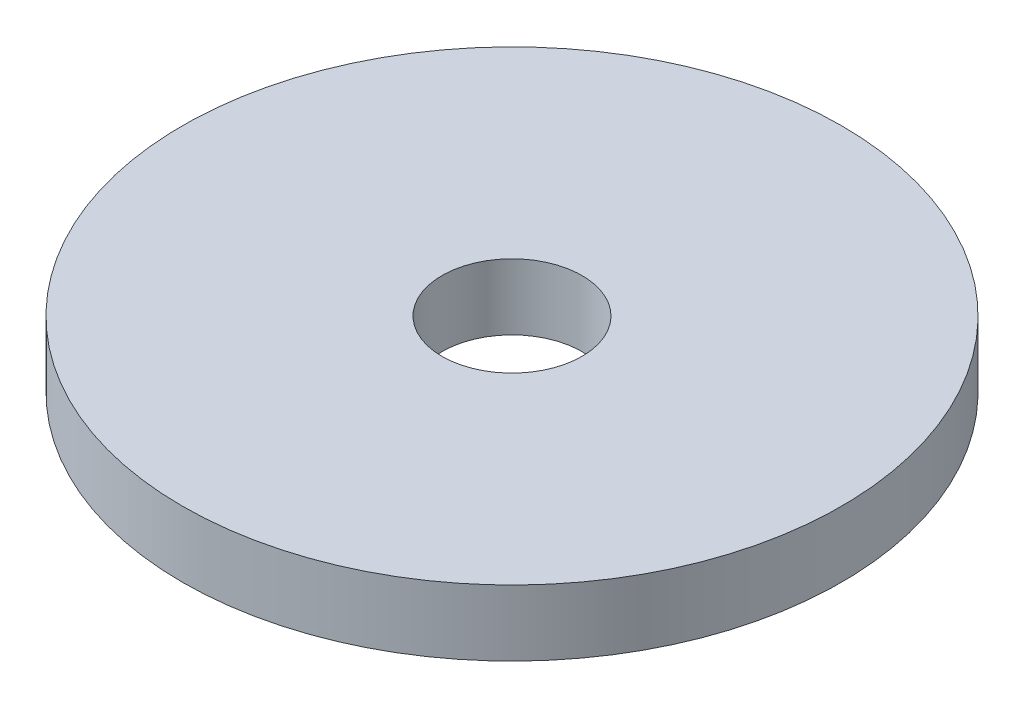
ISO-10303-21;
HEADER;
FILE_DESCRIPTION(('STEP AP214'),'2;1');
FILE_NAME('part.step','',(''),(''),'','','');
FILE_SCHEMA(('AUTOMOTIVE_DESIGN { 1 0 10303 214 1 1 1 1 }'));
ENDSEC;
DATA;
#1=APPLICATION_CONTEXT('core data for automotive mechanical design processes');
#2=APPLICATION_PROTOCOL_DEFINITION('international standard','automotive_design',2000,#1);
#3=PRODUCT_CONTEXT('',#1,'mechanical');
#4=PRODUCT('Part','Part','',(#3));
#5=PRODUCT_RELATED_PRODUCT_CATEGORY('part','',(#4));
#6=PRODUCT_DEFINITION_FORMATION('','',#4);
#7=PRODUCT_DEFINITION_CONTEXT('part definition',#1,'design');
#8=PRODUCT_DEFINITION('design','',#6,#7);
#9=PRODUCT_DEFINITION_SHAPE('','',#8);
#10=(LENGTH_UNIT() NAMED_UNIT(*) SI_UNIT(.MILLI.,.METRE.));
#11=(NAMED_UNIT(*) PLANE_ANGLE_UNIT() SI_UNIT($,.RADIAN.));
#12=(NAMED_UNIT(*) SI_UNIT($,.STERADIAN.) SOLID_ANGLE_UNIT());
#13=UNCERTAINTY_MEASURE_WITH_UNIT(LENGTH_MEASURE(1.E-05),#10,'distance_accuracy_value','');
#14=(GEOMETRIC_REPRESENTATION_CONTEXT(3) GLOBAL_UNCERTAINTY_ASSIGNED_CONTEXT((#13)) GLOBAL_UNIT_ASSIGNED_CONTEXT((#10,
#11,#12)) REPRESENTATION_CONTEXT('',''));
#15=CARTESIAN_POINT('',(0.,0.,0.));
#16=DIRECTION('',(0.,0.,1.));
#17=DIRECTION('',(1.,0.,0.));
#18=AXIS2_PLACEMENT_3D('',#15,#16,#17);
#19=CARTESIAN_POINT('',(0.,2.,0.));
#20=DIRECTION('',(0.,1.,0.));
#21=DIRECTION('',(0.,0.,1.));
#22=AXIS2_PLACEMENT_3D('',#19,#20,#21);
#23=PLANE('',#22);
#24=CARTESIAN_POINT('',(0.,2.,0.));
#25=DIRECTION('',(0.,1.,0.));
#26=DIRECTION('',(0.,0.,1.));
#27=AXIS2_PLACEMENT_3D('',#24,#25,#26);
#28=CIRCLE('',#27,10.);
#29=CARTESIAN_POINT('',(0.,2.,10.));
#30=VERTEX_POINT('',#29);
#31=EDGE_CURVE('E10',#30,#30,#28,.T.);
#32=ORIENTED_EDGE('',*,*,#31,.T.);
#33=EDGE_LOOP('',(#32));
#34=FACE_BOUND('',#33,.T.);
#35=CARTESIAN_POINT('',(0.,2.,0.));
#36=DIRECTION('',(0.,1.,0.));
#37=DIRECTION('',(0.,0.,1.));
#38=AXIS2_PLACEMENT_3D('',#35,#36,#37);
#39=CIRCLE('',#38,2.125);
#40=CARTESIAN_POINT('',(0.,2.,2.125));
#41=VERTEX_POINT('',#40);
#42=EDGE_CURVE('E50',#41,#41,#39,.T.);
#43=ORIENTED_EDGE('',*,*,#42,.F.);
#44=EDGE_LOOP('',(#43));
#45=FACE_BOUND('',#44,.T.);
#46=ADVANCED_FACE('F37',(#34,#45),#23,.T.);
#47=CARTESIAN_POINT('',(0.,0.,0.));
#48=DIRECTION('',(0.,1.,0.));
#49=DIRECTION('',(0.,0.,1.));
#50=AXIS2_PLACEMENT_3D('',#47,#48,#49);
#51=PLANE('',#50);
#52=CARTESIAN_POINT('',(0.,0.,0.));
#53=DIRECTION('',(0.,1.,0.));
#54=DIRECTION('',(0.,0.,1.));
#55=AXIS2_PLACEMENT_3D('',#52,#53,#54);
#56=CIRCLE('',#55,10.);
#57=CARTESIAN_POINT('',(0.,0.,10.));
#58=VERTEX_POINT('',#57);
#59=EDGE_CURVE('E41',#58,#58,#56,.T.);
#60=ORIENTED_EDGE('',*,*,#59,.F.);
#61=EDGE_LOOP('',(#60));
#62=FACE_BOUND('',#61,.T.);
#63=CARTESIAN_POINT('',(0.,0.,0.));
#64=DIRECTION('',(0.,1.,0.));
#65=DIRECTION('',(0.,0.,1.));
#66=AXIS2_PLACEMENT_3D('',#63,#64,#65);
#67=CIRCLE('',#66,2.125);
#68=CARTESIAN_POINT('',(0.,0.,2.125));
#69=VERTEX_POINT('',#68);
#70=EDGE_CURVE('E52',#69,#69,#67,.T.);
#71=ORIENTED_EDGE('',*,*,#70,.T.);
#72=EDGE_LOOP('',(#71));
#73=FACE_BOUND('',#72,.T.);
#74=ADVANCED_FACE('F64',(#62,#73),#51,.F.);
#75=CARTESIAN_POINT('',(0.,2.,0.));
#76=DIRECTION('',(0.,-1.,0.));
#77=DIRECTION('',(0.,0.,-1.));
#78=AXIS2_PLACEMENT_3D('',#75,#76,#77);
#79=CYLINDRICAL_SURFACE('',#78,10.);
#80=ORIENTED_EDGE('',*,*,#31,.F.);
#81=EDGE_LOOP('',(#80));
#82=FACE_BOUND('',#81,.T.);
#83=ORIENTED_EDGE('',*,*,#59,.T.);
#84=EDGE_LOOP('',(#83));
#85=FACE_BOUND('',#84,.T.);
#86=ADVANCED_FACE('F39',(#82,#85),#79,.T.);
#87=CARTESIAN_POINT('',(0.,2.,0.));
#88=DIRECTION('',(0.,-1.,0.));
#89=DIRECTION('',(0.,0.,-1.));
#90=AXIS2_PLACEMENT_3D('',#87,#88,#89);
#91=CYLINDRICAL_SURFACE('',#90,2.125);
#92=ORIENTED_EDGE('',*,*,#42,.T.);
#93=EDGE_LOOP('',(#92));
#94=FACE_BOUND('',#93,.T.);
#95=ORIENTED_EDGE('',*,*,#70,.F.);
#96=EDGE_LOOP('',(#95));
#97=FACE_BOUND('',#96,.T.);
#98=ADVANCED_FACE('F60',(#94,#97),#91,.F.);
#99=CLOSED_SHELL('',(#46,#74,#86,#98));
#100=MANIFOLD_SOLID_BREP('B2',#99);
#101=ADVANCED_BREP_SHAPE_REPRESENTATION('',(#18,#100),#14);
#102=SHAPE_DEFINITION_REPRESENTATION(#9,#101);
ENDSEC;
END-ISO-10303-21;
